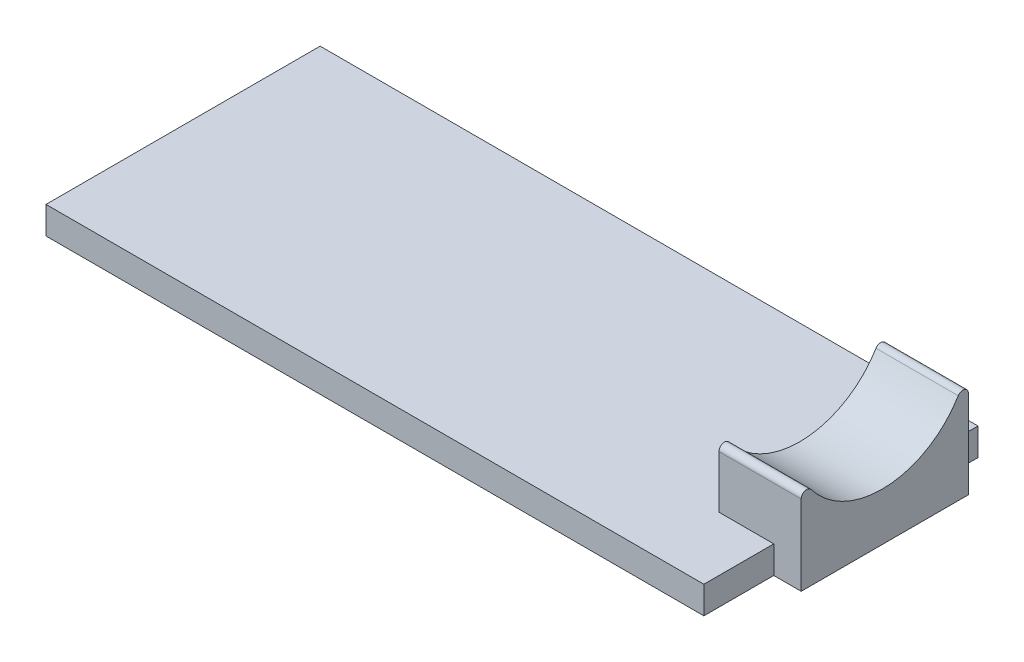
ISO-10303-21;
HEADER;
FILE_DESCRIPTION(('STEP AP214'),'2;1');
FILE_NAME('part.step','',(''),(''),'','','');
FILE_SCHEMA(('AUTOMOTIVE_DESIGN { 1 0 10303 214 1 1 1 1 }'));
ENDSEC;
DATA;
#1=APPLICATION_CONTEXT('core data for automotive mechanical design processes');
#2=APPLICATION_PROTOCOL_DEFINITION('international standard','automotive_design',2000,#1);
#3=PRODUCT_CONTEXT('',#1,'mechanical');
#4=PRODUCT('Part','Part','',(#3));
#5=PRODUCT_RELATED_PRODUCT_CATEGORY('part','',(#4));
#6=PRODUCT_DEFINITION_FORMATION('','',#4);
#7=PRODUCT_DEFINITION_CONTEXT('part definition',#1,'design');
#8=PRODUCT_DEFINITION('design','',#6,#7);
#9=PRODUCT_DEFINITION_SHAPE('','',#8);
#10=(LENGTH_UNIT() NAMED_UNIT(*) SI_UNIT(.MILLI.,.METRE.));
#11=(NAMED_UNIT(*) PLANE_ANGLE_UNIT() SI_UNIT($,.RADIAN.));
#12=(NAMED_UNIT(*) SI_UNIT($,.STERADIAN.) SOLID_ANGLE_UNIT());
#13=UNCERTAINTY_MEASURE_WITH_UNIT(LENGTH_MEASURE(1.E-05),#10,'distance_accuracy_value','');
#14=(GEOMETRIC_REPRESENTATION_CONTEXT(3) GLOBAL_UNCERTAINTY_ASSIGNED_CONTEXT((#13)) GLOBAL_UNIT_ASSIGNED_CONTEXT((#10,
#11,#12)) REPRESENTATION_CONTEXT('',''));
#15=CARTESIAN_POINT('',(0.,0.,0.));
#16=DIRECTION('',(0.,0.,1.));
#17=DIRECTION('',(1.,0.,0.));
#18=AXIS2_PLACEMENT_3D('',#15,#16,#17);
#19=CARTESIAN_POINT('',(0.,1.,0.));
#20=DIRECTION('',(-1.,0.,0.));
#21=DIRECTION('',(0.,0.,1.));
#22=AXIS2_PLACEMENT_3D('',#19,#20,#21);
#23=PLANE('',#22);
#24=DIRECTION('',(0.,1.,0.));
#25=VECTOR('',#24,1.);
#26=CARTESIAN_POINT('',(0.,-6.18142378421024,-2.55));
#27=LINE('',#26,#25);
#28=CARTESIAN_POINT('',(0.,0.,-2.55));
#29=VERTEX_POINT('',#28);
#30=CARTESIAN_POINT('',(0.,1.,-2.55));
#31=VERTEX_POINT('',#30);
#32=EDGE_CURVE('E125',#29,#31,#27,.T.);
#33=ORIENTED_EDGE('',*,*,#32,.T.);
#34=DIRECTION('',(0.,0.,-1.));
#35=VECTOR('',#34,1.);
#36=CARTESIAN_POINT('',(0.,1.,0.));
#37=LINE('',#36,#35);
#38=CARTESIAN_POINT('',(0.,1.,0.));
#39=VERTEX_POINT('',#38);
#40=EDGE_CURVE('E128',#39,#31,#37,.T.);
#41=ORIENTED_EDGE('',*,*,#40,.F.);
#42=DIRECTION('',(0.,-1.,0.));
#43=VECTOR('',#42,1.);
#44=CARTESIAN_POINT('',(0.,1.,0.));
#45=LINE('',#44,#43);
#46=CARTESIAN_POINT('',(0.,0.,0.));
#47=VERTEX_POINT('',#46);
#48=EDGE_CURVE('E169',#39,#47,#45,.T.);
#49=ORIENTED_EDGE('',*,*,#48,.T.);
#50=DIRECTION('',(0.,0.,-1.));
#51=VECTOR('',#50,1.);
#52=CARTESIAN_POINT('',(0.,0.,0.));
#53=LINE('',#52,#51);
#54=EDGE_CURVE('E130',#47,#29,#53,.T.);
#55=ORIENTED_EDGE('',*,*,#54,.T.);
#56=EDGE_LOOP('',(#33,#41,#49,#55));
#57=FACE_BOUND('',#56,.T.);
#58=ADVANCED_FACE('F35',(#57),#23,.F.);
#59=DIRECTION('',(0.,1.,0.));
#60=VECTOR('',#59,1.);
#61=CARTESIAN_POINT('',(0.,-6.18142378421024,-8.65));
#62=LINE('',#61,#60);
#63=CARTESIAN_POINT('',(0.,0.,-8.65));
#64=VERTEX_POINT('',#63);
#65=CARTESIAN_POINT('',(0.,1.,-8.65));
#66=VERTEX_POINT('',#65);
#67=EDGE_CURVE('E134',#64,#66,#62,.T.);
#68=ORIENTED_EDGE('',*,*,#67,.F.);
#69=CARTESIAN_POINT('',(0.,0.,-10.));
#70=VERTEX_POINT('',#69);
#71=EDGE_CURVE('E163',#64,#70,#53,.T.);
#72=ORIENTED_EDGE('',*,*,#71,.T.);
#73=DIRECTION('',(0.,-1.,0.));
#74=VECTOR('',#73,1.);
#75=CARTESIAN_POINT('',(0.,1.,-10.));
#76=LINE('',#75,#74);
#77=CARTESIAN_POINT('',(0.,1.,-10.));
#78=VERTEX_POINT('',#77);
#79=EDGE_CURVE('E184',#78,#70,#76,.T.);
#80=ORIENTED_EDGE('',*,*,#79,.F.);
#81=EDGE_CURVE('E146',#66,#78,#37,.T.);
#82=ORIENTED_EDGE('',*,*,#81,.F.);
#83=EDGE_LOOP('',(#68,#72,#80,#82));
#84=FACE_BOUND('',#83,.T.);
#85=ADVANCED_FACE('F241',(#84),#23,.F.);
#86=CARTESIAN_POINT('',(-2.,4.25,-8.65));
#87=DIRECTION('',(0.,0.,1.));
#88=DIRECTION('',(1.,0.,0.));
#89=AXIS2_PLACEMENT_3D('',#86,#87,#88);
#90=PLANE('',#89);
#91=DIRECTION('',(0.,-1.,0.));
#92=VECTOR('',#91,1.);
#93=CARTESIAN_POINT('',(-2.,4.25,-8.65));
#94=LINE('',#93,#92);
#95=CARTESIAN_POINT('',(-2.,3.21114561800017,-8.65));
#96=VERTEX_POINT('',#95);
#97=CARTESIAN_POINT('',(-2.,1.,-8.65));
#98=VERTEX_POINT('',#97);
#99=EDGE_CURVE('E160',#96,#98,#94,.T.);
#100=ORIENTED_EDGE('',*,*,#99,.F.);
#101=DIRECTION('',(1.,0.,0.));
#102=VECTOR('',#101,1.);
#103=CARTESIAN_POINT('',(0.999999999999999,3.21114561800017,-8.65));
#104=LINE('',#103,#102);
#105=CARTESIAN_POINT('',(0.999999999999999,3.21114561800017,-8.65));
#106=VERTEX_POINT('',#105);
#107=EDGE_CURVE('E58',#96,#106,#104,.T.);
#108=ORIENTED_EDGE('',*,*,#107,.T.);
#109=DIRECTION('',(0.,-1.,0.));
#110=VECTOR('',#109,1.);
#111=CARTESIAN_POINT('',(0.999999999999999,4.25,-8.65));
#112=LINE('',#111,#110);
#113=CARTESIAN_POINT('',(0.999999999999999,0.,-8.65));
#114=VERTEX_POINT('',#113);
#115=EDGE_CURVE('E162',#106,#114,#112,.T.);
#116=ORIENTED_EDGE('',*,*,#115,.T.);
#117=DIRECTION('',(-1.,0.,0.));
#118=VECTOR('',#117,1.);
#119=CARTESIAN_POINT('',(0.,0.,-8.65));
#120=LINE('',#119,#118);
#121=EDGE_CURVE('E222',#114,#64,#120,.T.);
#122=ORIENTED_EDGE('',*,*,#121,.T.);
#123=ORIENTED_EDGE('',*,*,#67,.T.);
#124=DIRECTION('',(-1.,0.,0.));
#125=VECTOR('',#124,1.);
#126=CARTESIAN_POINT('',(-2.,1.,-8.65));
#127=LINE('',#126,#125);
#128=EDGE_CURVE('E187',#66,#98,#127,.T.);
#129=ORIENTED_EDGE('',*,*,#128,.T.);
#130=EDGE_LOOP('',(#100,#108,#116,#122,#123,#129));
#131=FACE_BOUND('',#130,.T.);
#132=ADVANCED_FACE('F216',(#131),#90,.F.);
#133=CARTESIAN_POINT('',(1.,4.25,-2.55));
#134=DIRECTION('',(0.,0.,-1.));
#135=DIRECTION('',(-1.,0.,0.));
#136=AXIS2_PLACEMENT_3D('',#133,#134,#135);
#137=PLANE('',#136);
#138=DIRECTION('',(0.,-1.,0.));
#139=VECTOR('',#138,1.);
#140=CARTESIAN_POINT('',(1.,4.25,-2.55));
#141=LINE('',#140,#139);
#142=CARTESIAN_POINT('',(1.,2.91673333440003,-2.55));
#143=VERTEX_POINT('',#142);
#144=CARTESIAN_POINT('',(0.999999999999998,0.,-2.55));
#145=VERTEX_POINT('',#144);
#146=EDGE_CURVE('E151',#143,#145,#141,.T.);
#147=ORIENTED_EDGE('',*,*,#146,.F.);
#148=DIRECTION('',(1.,0.,0.));
#149=VECTOR('',#148,1.);
#150=CARTESIAN_POINT('',(-2.,2.91673333440003,-2.55));
#151=LINE('',#150,#149);
#152=CARTESIAN_POINT('',(-2.,2.91673333440003,-2.55));
#153=VERTEX_POINT('',#152);
#154=EDGE_CURVE('E11',#143,#153,#151,.F.);
#155=ORIENTED_EDGE('',*,*,#154,.T.);
#156=DIRECTION('',(0.,-1.,0.));
#157=VECTOR('',#156,1.);
#158=CARTESIAN_POINT('',(-2.,4.25,-2.55));
#159=LINE('',#158,#157);
#160=CARTESIAN_POINT('',(-2.,1.,-2.55));
#161=VERTEX_POINT('',#160);
#162=EDGE_CURVE('E150',#153,#161,#159,.T.);
#163=ORIENTED_EDGE('',*,*,#162,.T.);
#164=DIRECTION('',(1.,0.,0.));
#165=VECTOR('',#164,1.);
#166=CARTESIAN_POINT('',(1.,1.,-2.55));
#167=LINE('',#166,#165);
#168=EDGE_CURVE('E140',#161,#31,#167,.T.);
#169=ORIENTED_EDGE('',*,*,#168,.T.);
#170=ORIENTED_EDGE('',*,*,#32,.F.);
#171=DIRECTION('',(1.,0.,0.));
#172=VECTOR('',#171,1.);
#173=CARTESIAN_POINT('',(0.,0.,-2.55));
#174=LINE('',#173,#172);
#175=EDGE_CURVE('E223',#29,#145,#174,.T.);
#176=ORIENTED_EDGE('',*,*,#175,.T.);
#177=EDGE_LOOP('',(#147,#155,#163,#169,#170,#176));
#178=FACE_BOUND('',#177,.T.);
#179=ADVANCED_FACE('F148',(#178),#137,.F.);
#180=CARTESIAN_POINT('',(0.,1.,-10.));
#181=DIRECTION('',(0.,0.,1.));
#182=DIRECTION('',(1.,0.,0.));
#183=AXIS2_PLACEMENT_3D('',#180,#181,#182);
#184=PLANE('',#183);
#185=DIRECTION('',(-1.,0.,0.));
#186=VECTOR('',#185,1.);
#187=CARTESIAN_POINT('',(0.,0.,-10.));
#188=LINE('',#187,#186);
#189=CARTESIAN_POINT('',(-24.,0.,-10.));
#190=VERTEX_POINT('',#189);
#191=EDGE_CURVE('E171',#70,#190,#188,.T.);
#192=ORIENTED_EDGE('',*,*,#191,.T.);
#193=DIRECTION('',(0.,-1.,0.));
#194=VECTOR('',#193,1.);
#195=CARTESIAN_POINT('',(-24.,1.,-10.));
#196=LINE('',#195,#194);
#197=CARTESIAN_POINT('',(-24.,1.,-10.));
#198=VERTEX_POINT('',#197);
#199=EDGE_CURVE('E181',#198,#190,#196,.T.);
#200=ORIENTED_EDGE('',*,*,#199,.F.);
#201=DIRECTION('',(-1.,0.,0.));
#202=VECTOR('',#201,1.);
#203=CARTESIAN_POINT('',(0.,1.,-10.));
#204=LINE('',#203,#202);
#205=EDGE_CURVE('E145',#78,#198,#204,.T.);
#206=ORIENTED_EDGE('',*,*,#205,.F.);
#207=ORIENTED_EDGE('',*,*,#79,.T.);
#208=EDGE_LOOP('',(#192,#200,#206,#207));
#209=FACE_BOUND('',#208,.T.);
#210=ADVANCED_FACE('F248',(#209),#184,.F.);
#211=CARTESIAN_POINT('',(-24.,1.,0.));
#212=DIRECTION('',(1.,0.,0.));
#213=DIRECTION('',(0.,0.,-1.));
#214=AXIS2_PLACEMENT_3D('',#211,#212,#213);
#215=PLANE('',#214);
#216=DIRECTION('',(0.,0.,1.));
#217=VECTOR('',#216,1.);
#218=CARTESIAN_POINT('',(-24.,0.,0.));
#219=LINE('',#218,#217);
#220=CARTESIAN_POINT('',(-24.,0.,0.));
#221=VERTEX_POINT('',#220);
#222=EDGE_CURVE('E173',#190,#221,#219,.T.);
#223=ORIENTED_EDGE('',*,*,#222,.T.);
#224=DIRECTION('',(0.,-1.,0.));
#225=VECTOR('',#224,1.);
#226=CARTESIAN_POINT('',(-24.,1.,0.));
#227=LINE('',#226,#225);
#228=CARTESIAN_POINT('',(-24.,1.,0.));
#229=VERTEX_POINT('',#228);
#230=EDGE_CURVE('E178',#229,#221,#227,.T.);
#231=ORIENTED_EDGE('',*,*,#230,.F.);
#232=DIRECTION('',(0.,0.,1.));
#233=VECTOR('',#232,1.);
#234=CARTESIAN_POINT('',(-24.,1.,0.));
#235=LINE('',#234,#233);
#236=EDGE_CURVE('E166',#198,#229,#235,.T.);
#237=ORIENTED_EDGE('',*,*,#236,.F.);
#238=ORIENTED_EDGE('',*,*,#199,.T.);
#239=EDGE_LOOP('',(#223,#231,#237,#238));
#240=FACE_BOUND('',#239,.T.);
#241=ADVANCED_FACE('F251',(#240),#215,.F.);
#242=CARTESIAN_POINT('',(0.,1.,0.));
#243=DIRECTION('',(0.,0.,-1.));
#244=DIRECTION('',(-1.,0.,0.));
#245=AXIS2_PLACEMENT_3D('',#242,#243,#244);
#246=PLANE('',#245);
#247=DIRECTION('',(1.,0.,0.));
#248=VECTOR('',#247,1.);
#249=CARTESIAN_POINT('',(0.,0.,0.));
#250=LINE('',#249,#248);
#251=EDGE_CURVE('E175',#221,#47,#250,.T.);
#252=ORIENTED_EDGE('',*,*,#251,.T.);
#253=ORIENTED_EDGE('',*,*,#48,.F.);
#254=DIRECTION('',(1.,0.,0.));
#255=VECTOR('',#254,1.);
#256=CARTESIAN_POINT('',(0.,1.,0.));
#257=LINE('',#256,#255);
#258=EDGE_CURVE('E143',#229,#39,#257,.T.);
#259=ORIENTED_EDGE('',*,*,#258,.F.);
#260=ORIENTED_EDGE('',*,*,#230,.T.);
#261=EDGE_LOOP('',(#252,#253,#259,#260));
#262=FACE_BOUND('',#261,.T.);
#263=ADVANCED_FACE('F255',(#262),#246,.F.);
#264=CARTESIAN_POINT('',(0.,1.,0.));
#265=DIRECTION('',(0.,1.,0.));
#266=DIRECTION('',(0.,0.,1.));
#267=AXIS2_PLACEMENT_3D('',#264,#265,#266);
#268=PLANE('',#267);
#269=ORIENTED_EDGE('',*,*,#168,.F.);
#270=DIRECTION('',(0.,0.,1.));
#271=VECTOR('',#270,1.);
#272=CARTESIAN_POINT('',(-2.,1.,-2.55));
#273=LINE('',#272,#271);
#274=EDGE_CURVE('E152',#98,#161,#273,.T.);
#275=ORIENTED_EDGE('',*,*,#274,.F.);
#276=ORIENTED_EDGE('',*,*,#128,.F.);
#277=ORIENTED_EDGE('',*,*,#81,.T.);
#278=ORIENTED_EDGE('',*,*,#205,.T.);
#279=ORIENTED_EDGE('',*,*,#236,.T.);
#280=ORIENTED_EDGE('',*,*,#258,.T.);
#281=ORIENTED_EDGE('',*,*,#40,.T.);
#282=EDGE_LOOP('',(#269,#275,#276,#277,#278,#279,#280,#281));
#283=FACE_BOUND('',#282,.T.);
#284=ADVANCED_FACE('F138',(#283),#268,.T.);
#285=CARTESIAN_POINT('',(0.,0.,0.));
#286=DIRECTION('',(0.,1.,0.));
#287=DIRECTION('',(0.,0.,1.));
#288=AXIS2_PLACEMENT_3D('',#285,#286,#287);
#289=PLANE('',#288);
#290=ORIENTED_EDGE('',*,*,#54,.F.);
#291=ORIENTED_EDGE('',*,*,#251,.F.);
#292=ORIENTED_EDGE('',*,*,#222,.F.);
#293=ORIENTED_EDGE('',*,*,#191,.F.);
#294=ORIENTED_EDGE('',*,*,#71,.F.);
#295=ORIENTED_EDGE('',*,*,#121,.F.);
#296=DIRECTION('',(0.,0.,-1.));
#297=VECTOR('',#296,1.);
#298=CARTESIAN_POINT('',(0.999999999999998,0.,-2.55));
#299=LINE('',#298,#297);
#300=EDGE_CURVE('E225',#145,#114,#299,.T.);
#301=ORIENTED_EDGE('',*,*,#300,.F.);
#302=ORIENTED_EDGE('',*,*,#175,.F.);
#303=EDGE_LOOP('',(#290,#291,#292,#293,#294,#295,#301,#302));
#304=FACE_BOUND('',#303,.T.);
#305=ADVANCED_FACE('F231',(#304),#289,.F.);
#306=CARTESIAN_POINT('',(0.999999999999999,4.25,-8.65));
#307=DIRECTION('',(-1.,0.,0.));
#308=DIRECTION('',(0.,0.,1.));
#309=AXIS2_PLACEMENT_3D('',#306,#307,#308);
#310=PLANE('',#309);
#311=ORIENTED_EDGE('',*,*,#115,.F.);
#312=CARTESIAN_POINT('',(0.999999999999999,3.21114561800017,-8.45));
#313=DIRECTION('',(-1.,0.,0.));
#314=DIRECTION('',(0.,0.,1.));
#315=AXIS2_PLACEMENT_3D('',#312,#313,#314);
#316=CIRCLE('',#315,0.2);
#317=CARTESIAN_POINT('',(0.999999999999999,3.31484732130451,-8.27898550724638));
#318=VERTEX_POINT('',#317);
#319=EDGE_CURVE('E43',#106,#318,#316,.F.);
#320=ORIENTED_EDGE('',*,*,#319,.T.);
#321=CARTESIAN_POINT('',(0.999999999999999,5.,-5.5));
#322=DIRECTION('',(-1.,0.,0.));
#323=DIRECTION('',(0.,0.,1.));
#324=AXIS2_PLACEMENT_3D('',#321,#322,#323);
#325=CIRCLE('',#324,3.25);
#326=CARTESIAN_POINT('',(1.,3.0375024164638,-2.90942028985507));
#327=VERTEX_POINT('',#326);
#328=EDGE_CURVE('E155',#318,#327,#325,.T.);
#329=ORIENTED_EDGE('',*,*,#328,.T.);
#330=CARTESIAN_POINT('',(0.999999999999999,2.91673333440003,-2.75));
#331=DIRECTION('',(-1.,0.,0.));
#332=DIRECTION('',(0.,0.,1.));
#333=AXIS2_PLACEMENT_3D('',#330,#331,#332);
#334=CIRCLE('',#333,0.2);
#335=EDGE_CURVE('E50',#327,#143,#334,.F.);
#336=ORIENTED_EDGE('',*,*,#335,.T.);
#337=ORIENTED_EDGE('',*,*,#146,.T.);
#338=ORIENTED_EDGE('',*,*,#300,.T.);
#339=EDGE_LOOP('',(#311,#320,#329,#336,#337,#338));
#340=FACE_BOUND('',#339,.T.);
#341=ADVANCED_FACE('F201',(#340),#310,.F.);
#342=CARTESIAN_POINT('',(-2.,4.25,-2.55));
#343=DIRECTION('',(1.,0.,0.));
#344=DIRECTION('',(0.,0.,-1.));
#345=AXIS2_PLACEMENT_3D('',#342,#343,#344);
#346=PLANE('',#345);
#347=CARTESIAN_POINT('',(-2.,5.,-5.5));
#348=DIRECTION('',(1.,0.,0.));
#349=DIRECTION('',(0.,0.,-1.));
#350=AXIS2_PLACEMENT_3D('',#347,#348,#349);
#351=CIRCLE('',#350,3.25);
#352=CARTESIAN_POINT('',(-2.,3.0375024164638,-2.90942028985507));
#353=VERTEX_POINT('',#352);
#354=CARTESIAN_POINT('',(-2.,3.31484732130451,-8.27898550724638));
#355=VERTEX_POINT('',#354);
#356=EDGE_CURVE('E210',#353,#355,#351,.T.);
#357=ORIENTED_EDGE('',*,*,#356,.T.);
#358=CARTESIAN_POINT('',(-2.,3.21114561800017,-8.45));
#359=DIRECTION('',(1.,0.,0.));
#360=DIRECTION('',(0.,0.,-1.));
#361=AXIS2_PLACEMENT_3D('',#358,#359,#360);
#362=CIRCLE('',#361,0.2);
#363=EDGE_CURVE('E196',#355,#96,#362,.F.);
#364=ORIENTED_EDGE('',*,*,#363,.T.);
#365=ORIENTED_EDGE('',*,*,#99,.T.);
#366=ORIENTED_EDGE('',*,*,#274,.T.);
#367=ORIENTED_EDGE('',*,*,#162,.F.);
#368=CARTESIAN_POINT('',(-2.,2.91673333440003,-2.75));
#369=DIRECTION('',(1.,0.,0.));
#370=DIRECTION('',(0.,0.,-1.));
#371=AXIS2_PLACEMENT_3D('',#368,#369,#370);
#372=CIRCLE('',#371,0.2);
#373=EDGE_CURVE('E194',#153,#353,#372,.F.);
#374=ORIENTED_EDGE('',*,*,#373,.T.);
#375=EDGE_LOOP('',(#357,#364,#365,#366,#367,#374));
#376=FACE_BOUND('',#375,.T.);
#377=ADVANCED_FACE('F214',(#376),#346,.F.);
#378=CARTESIAN_POINT('',(10.1923881554251,5.,-5.5));
#379=DIRECTION('',(-1.,0.,0.));
#380=DIRECTION('',(0.,0.,1.));
#381=AXIS2_PLACEMENT_3D('',#378,#379,#380);
#382=CYLINDRICAL_SURFACE('',#381,3.25);
#383=ORIENTED_EDGE('',*,*,#328,.F.);
#384=DIRECTION('',(-1.,0.,0.));
#385=VECTOR('',#384,1.);
#386=CARTESIAN_POINT('',(10.1923881554251,3.31484732130451,-8.27898550724638));
#387=LINE('',#386,#385);
#388=EDGE_CURVE('E191',#318,#355,#387,.T.);
#389=ORIENTED_EDGE('',*,*,#388,.T.);
#390=ORIENTED_EDGE('',*,*,#356,.F.);
#391=DIRECTION('',(-1.,0.,0.));
#392=VECTOR('',#391,1.);
#393=CARTESIAN_POINT('',(10.1923881554251,3.0375024164638,-2.90942028985507));
#394=LINE('',#393,#392);
#395=EDGE_CURVE('E188',#353,#327,#394,.F.);
#396=ORIENTED_EDGE('',*,*,#395,.T.);
#397=EDGE_LOOP('',(#383,#389,#390,#396));
#398=FACE_BOUND('',#397,.T.);
#399=ADVANCED_FACE('F206',(#398),#382,.F.);
#400=CARTESIAN_POINT('',(10.1923881554251,3.21114561800017,-8.45));
#401=DIRECTION('',(-1.,0.,0.));
#402=DIRECTION('',(0.,0.,1.));
#403=AXIS2_PLACEMENT_3D('',#400,#401,#402);
#404=CYLINDRICAL_SURFACE('',#403,0.2);
#405=ORIENTED_EDGE('',*,*,#319,.F.);
#406=ORIENTED_EDGE('',*,*,#107,.F.);
#407=ORIENTED_EDGE('',*,*,#363,.F.);
#408=ORIENTED_EDGE('',*,*,#388,.F.);
#409=EDGE_LOOP('',(#405,#406,#407,#408));
#410=FACE_BOUND('',#409,.T.);
#411=ADVANCED_FACE('F212',(#410),#404,.T.);
#412=CARTESIAN_POINT('',(10.1923881554251,2.91673333440003,-2.75));
#413=DIRECTION('',(-1.,0.,0.));
#414=DIRECTION('',(0.,0.,1.));
#415=AXIS2_PLACEMENT_3D('',#412,#413,#414);
#416=CYLINDRICAL_SURFACE('',#415,0.2);
#417=ORIENTED_EDGE('',*,*,#373,.F.);
#418=ORIENTED_EDGE('',*,*,#154,.F.);
#419=ORIENTED_EDGE('',*,*,#335,.F.);
#420=ORIENTED_EDGE('',*,*,#395,.F.);
#421=EDGE_LOOP('',(#417,#418,#419,#420));
#422=FACE_BOUND('',#421,.T.);
#423=ADVANCED_FACE('F37',(#422),#416,.T.);
#424=CLOSED_SHELL('',(#58,#85,#132,#179,#210,#241,#263,#284,#305,#341,#377,#399,#411,#423));
#425=MANIFOLD_SOLID_BREP('B2',#424);
#426=ADVANCED_BREP_SHAPE_REPRESENTATION('',(#18,#425),#14);
#427=SHAPE_DEFINITION_REPRESENTATION(#9,#426);
ENDSEC;
END-ISO-10303-21;
